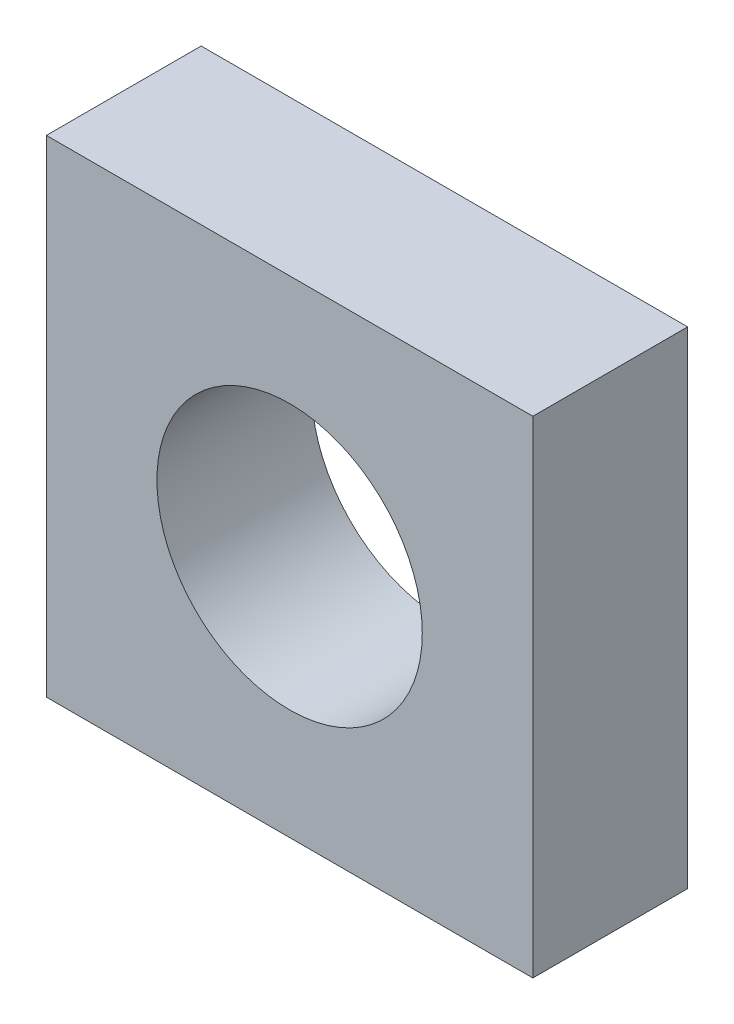
ISO-10303-21;
HEADER;
FILE_DESCRIPTION(('STEP AP214'),'2;1');
FILE_NAME('part.step','',(''),(''),'','','');
FILE_SCHEMA(('AUTOMOTIVE_DESIGN { 1 0 10303 214 1 1 1 1 }'));
ENDSEC;
DATA;
#1=APPLICATION_CONTEXT('core data for automotive mechanical design processes');
#2=APPLICATION_PROTOCOL_DEFINITION('international standard','automotive_design',2000,#1);
#3=PRODUCT_CONTEXT('',#1,'mechanical');
#4=PRODUCT('Part','Part','',(#3));
#5=PRODUCT_RELATED_PRODUCT_CATEGORY('part','',(#4));
#6=PRODUCT_DEFINITION_FORMATION('','',#4);
#7=PRODUCT_DEFINITION_CONTEXT('part definition',#1,'design');
#8=PRODUCT_DEFINITION('design','',#6,#7);
#9=PRODUCT_DEFINITION_SHAPE('','',#8);
#10=(LENGTH_UNIT() NAMED_UNIT(*) SI_UNIT(.MILLI.,.METRE.));
#11=(NAMED_UNIT(*) PLANE_ANGLE_UNIT() SI_UNIT($,.RADIAN.));
#12=(NAMED_UNIT(*) SI_UNIT($,.STERADIAN.) SOLID_ANGLE_UNIT());
#13=UNCERTAINTY_MEASURE_WITH_UNIT(LENGTH_MEASURE(1.E-05),#10,'distance_accuracy_value','');
#14=(GEOMETRIC_REPRESENTATION_CONTEXT(3) GLOBAL_UNCERTAINTY_ASSIGNED_CONTEXT((#13)) GLOBAL_UNIT_ASSIGNED_CONTEXT((#10,
#11,#12)) REPRESENTATION_CONTEXT('',''));
#15=CARTESIAN_POINT('',(0.,0.,0.));
#16=DIRECTION('',(0.,0.,1.));
#17=DIRECTION('',(1.,0.,0.));
#18=AXIS2_PLACEMENT_3D('',#15,#16,#17);
#19=CARTESIAN_POINT('',(0.,5.5,1.75));
#20=DIRECTION('',(0.,0.,-1.));
#21=DIRECTION('',(-1.,0.,0.));
#22=AXIS2_PLACEMENT_3D('',#19,#20,#21);
#23=PLANE('',#22);
#24=DIRECTION('',(0.,-1.,0.));
#25=VECTOR('',#24,1.);
#26=CARTESIAN_POINT('',(0.,0.,1.75));
#27=LINE('',#26,#25);
#28=CARTESIAN_POINT('',(0.,5.5,1.75));
#29=VERTEX_POINT('',#28);
#30=CARTESIAN_POINT('',(0.,0.,1.75));
#31=VERTEX_POINT('',#30);
#32=EDGE_CURVE('E84',#29,#31,#27,.T.);
#33=ORIENTED_EDGE('',*,*,#32,.T.);
#34=DIRECTION('',(1.,0.,0.));
#35=VECTOR('',#34,1.);
#36=CARTESIAN_POINT('',(0.,0.,1.75));
#37=LINE('',#36,#35);
#38=CARTESIAN_POINT('',(5.5,0.,1.75));
#39=VERTEX_POINT('',#38);
#40=EDGE_CURVE('E79',#31,#39,#37,.T.);
#41=ORIENTED_EDGE('',*,*,#40,.T.);
#42=DIRECTION('',(0.,1.,0.));
#43=VECTOR('',#42,1.);
#44=CARTESIAN_POINT('',(5.5,0.,1.75));
#45=LINE('',#44,#43);
#46=CARTESIAN_POINT('',(5.5,5.5,1.75));
#47=VERTEX_POINT('',#46);
#48=EDGE_CURVE('E82',#39,#47,#45,.T.);
#49=ORIENTED_EDGE('',*,*,#48,.T.);
#50=DIRECTION('',(-1.,0.,0.));
#51=VECTOR('',#50,1.);
#52=CARTESIAN_POINT('',(0.,5.5,1.75));
#53=LINE('',#52,#51);
#54=EDGE_CURVE('E49',#47,#29,#53,.T.);
#55=ORIENTED_EDGE('',*,*,#54,.T.);
#56=EDGE_LOOP('',(#33,#41,#49,#55));
#57=FACE_BOUND('',#56,.T.);
#58=CARTESIAN_POINT('',(2.75,2.75,1.75));
#59=DIRECTION('',(0.,0.,1.));
#60=DIRECTION('',(1.,0.,0.));
#61=AXIS2_PLACEMENT_3D('',#58,#59,#60);
#62=CIRCLE('',#61,1.5);
#63=CARTESIAN_POINT('',(4.25,2.75,1.75));
#64=VERTEX_POINT('',#63);
#65=EDGE_CURVE('E99',#64,#64,#62,.T.);
#66=ORIENTED_EDGE('',*,*,#65,.F.);
#67=EDGE_LOOP('',(#66));
#68=FACE_BOUND('',#67,.T.);
#69=ADVANCED_FACE('F32',(#57,#68),#23,.F.);
#70=CARTESIAN_POINT('',(0.,5.5,0.));
#71=DIRECTION('',(0.,0.,-1.));
#72=DIRECTION('',(-1.,0.,0.));
#73=AXIS2_PLACEMENT_3D('',#70,#71,#72);
#74=PLANE('',#73);
#75=DIRECTION('',(0.,-1.,0.));
#76=VECTOR('',#75,1.);
#77=CARTESIAN_POINT('',(0.,0.,0.));
#78=LINE('',#77,#76);
#79=CARTESIAN_POINT('',(0.,5.5,0.));
#80=VERTEX_POINT('',#79);
#81=CARTESIAN_POINT('',(0.,0.,0.));
#82=VERTEX_POINT('',#81);
#83=EDGE_CURVE('E96',#80,#82,#78,.T.);
#84=ORIENTED_EDGE('',*,*,#83,.F.);
#85=DIRECTION('',(-1.,0.,0.));
#86=VECTOR('',#85,1.);
#87=CARTESIAN_POINT('',(0.,5.5,0.));
#88=LINE('',#87,#86);
#89=CARTESIAN_POINT('',(5.5,5.5,0.));
#90=VERTEX_POINT('',#89);
#91=EDGE_CURVE('E72',#90,#80,#88,.T.);
#92=ORIENTED_EDGE('',*,*,#91,.F.);
#93=DIRECTION('',(0.,1.,0.));
#94=VECTOR('',#93,1.);
#95=CARTESIAN_POINT('',(5.5,0.,0.));
#96=LINE('',#95,#94);
#97=CARTESIAN_POINT('',(5.5,0.,0.));
#98=VERTEX_POINT('',#97);
#99=EDGE_CURVE('E66',#98,#90,#96,.T.);
#100=ORIENTED_EDGE('',*,*,#99,.F.);
#101=DIRECTION('',(1.,0.,0.));
#102=VECTOR('',#101,1.);
#103=CARTESIAN_POINT('',(0.,0.,0.));
#104=LINE('',#103,#102);
#105=EDGE_CURVE('E88',#82,#98,#104,.T.);
#106=ORIENTED_EDGE('',*,*,#105,.F.);
#107=EDGE_LOOP('',(#84,#92,#100,#106));
#108=FACE_BOUND('',#107,.T.);
#109=CARTESIAN_POINT('',(2.75,2.75,0.));
#110=DIRECTION('',(0.,0.,1.));
#111=DIRECTION('',(1.,0.,0.));
#112=AXIS2_PLACEMENT_3D('',#109,#110,#111);
#113=CIRCLE('',#112,1.5);
#114=CARTESIAN_POINT('',(4.25,2.75,0.));
#115=VERTEX_POINT('',#114);
#116=EDGE_CURVE('E111',#115,#115,#113,.T.);
#117=ORIENTED_EDGE('',*,*,#116,.T.);
#118=EDGE_LOOP('',(#117));
#119=FACE_BOUND('',#118,.T.);
#120=ADVANCED_FACE('F107',(#108,#119),#74,.T.);
#121=CARTESIAN_POINT('',(0.,0.,1.75));
#122=DIRECTION('',(1.,0.,0.));
#123=DIRECTION('',(0.,0.,-1.));
#124=AXIS2_PLACEMENT_3D('',#121,#122,#123);
#125=PLANE('',#124);
#126=ORIENTED_EDGE('',*,*,#83,.T.);
#127=DIRECTION('',(0.,0.,-1.));
#128=VECTOR('',#127,1.);
#129=CARTESIAN_POINT('',(0.,0.,1.75));
#130=LINE('',#129,#128);
#131=EDGE_CURVE('E11',#31,#82,#130,.T.);
#132=ORIENTED_EDGE('',*,*,#131,.F.);
#133=ORIENTED_EDGE('',*,*,#32,.F.);
#134=DIRECTION('',(0.,0.,-1.));
#135=VECTOR('',#134,1.);
#136=CARTESIAN_POINT('',(0.,5.5,1.75));
#137=LINE('',#136,#135);
#138=EDGE_CURVE('E92',#29,#80,#137,.T.);
#139=ORIENTED_EDGE('',*,*,#138,.T.);
#140=EDGE_LOOP('',(#126,#132,#133,#139));
#141=FACE_BOUND('',#140,.T.);
#142=ADVANCED_FACE('F34',(#141),#125,.F.);
#143=CARTESIAN_POINT('',(0.,0.,1.75));
#144=DIRECTION('',(0.,1.,0.));
#145=DIRECTION('',(0.,0.,1.));
#146=AXIS2_PLACEMENT_3D('',#143,#144,#145);
#147=PLANE('',#146);
#148=ORIENTED_EDGE('',*,*,#105,.T.);
#149=DIRECTION('',(0.,0.,-1.));
#150=VECTOR('',#149,1.);
#151=CARTESIAN_POINT('',(5.5,0.,1.75));
#152=LINE('',#151,#150);
#153=EDGE_CURVE('E41',#39,#98,#152,.T.);
#154=ORIENTED_EDGE('',*,*,#153,.F.);
#155=ORIENTED_EDGE('',*,*,#40,.F.);
#156=ORIENTED_EDGE('',*,*,#131,.T.);
#157=EDGE_LOOP('',(#148,#154,#155,#156));
#158=FACE_BOUND('',#157,.T.);
#159=ADVANCED_FACE('F87',(#158),#147,.F.);
#160=CARTESIAN_POINT('',(5.5,0.,1.75));
#161=DIRECTION('',(-1.,0.,0.));
#162=DIRECTION('',(0.,-1.,0.));
#163=AXIS2_PLACEMENT_3D('',#160,#161,#162);
#164=PLANE('',#163);
#165=ORIENTED_EDGE('',*,*,#99,.T.);
#166=DIRECTION('',(0.,0.,-1.));
#167=VECTOR('',#166,1.);
#168=CARTESIAN_POINT('',(5.5,5.5,1.75));
#169=LINE('',#168,#167);
#170=EDGE_CURVE('E89',#47,#90,#169,.T.);
#171=ORIENTED_EDGE('',*,*,#170,.F.);
#172=ORIENTED_EDGE('',*,*,#48,.F.);
#173=ORIENTED_EDGE('',*,*,#153,.T.);
#174=EDGE_LOOP('',(#165,#171,#172,#173));
#175=FACE_BOUND('',#174,.T.);
#176=ADVANCED_FACE('F90',(#175),#164,.F.);
#177=CARTESIAN_POINT('',(0.,5.5,1.75));
#178=DIRECTION('',(0.,-1.,0.));
#179=DIRECTION('',(0.,0.,-1.));
#180=AXIS2_PLACEMENT_3D('',#177,#178,#179);
#181=PLANE('',#180);
#182=ORIENTED_EDGE('',*,*,#91,.T.);
#183=ORIENTED_EDGE('',*,*,#138,.F.);
#184=ORIENTED_EDGE('',*,*,#54,.F.);
#185=ORIENTED_EDGE('',*,*,#170,.T.);
#186=EDGE_LOOP('',(#182,#183,#184,#185));
#187=FACE_BOUND('',#186,.T.);
#188=ADVANCED_FACE('F104',(#187),#181,.F.);
#189=CARTESIAN_POINT('',(2.75,2.75,1.75));
#190=DIRECTION('',(0.,0.,-1.));
#191=DIRECTION('',(-1.,0.,0.));
#192=AXIS2_PLACEMENT_3D('',#189,#190,#191);
#193=CYLINDRICAL_SURFACE('',#192,1.5);
#194=ORIENTED_EDGE('',*,*,#65,.T.);
#195=EDGE_LOOP('',(#194));
#196=FACE_BOUND('',#195,.T.);
#197=ORIENTED_EDGE('',*,*,#116,.F.);
#198=EDGE_LOOP('',(#197));
#199=FACE_BOUND('',#198,.T.);
#200=ADVANCED_FACE('F117',(#196,#199),#193,.F.);
#201=CLOSED_SHELL('',(#69,#120,#142,#159,#176,#188,#200));
#202=MANIFOLD_SOLID_BREP('B2',#201);
#203=ADVANCED_BREP_SHAPE_REPRESENTATION('',(#18,#202),#14);
#204=SHAPE_DEFINITION_REPRESENTATION(#9,#203);
ENDSEC;
END-ISO-10303-21;
